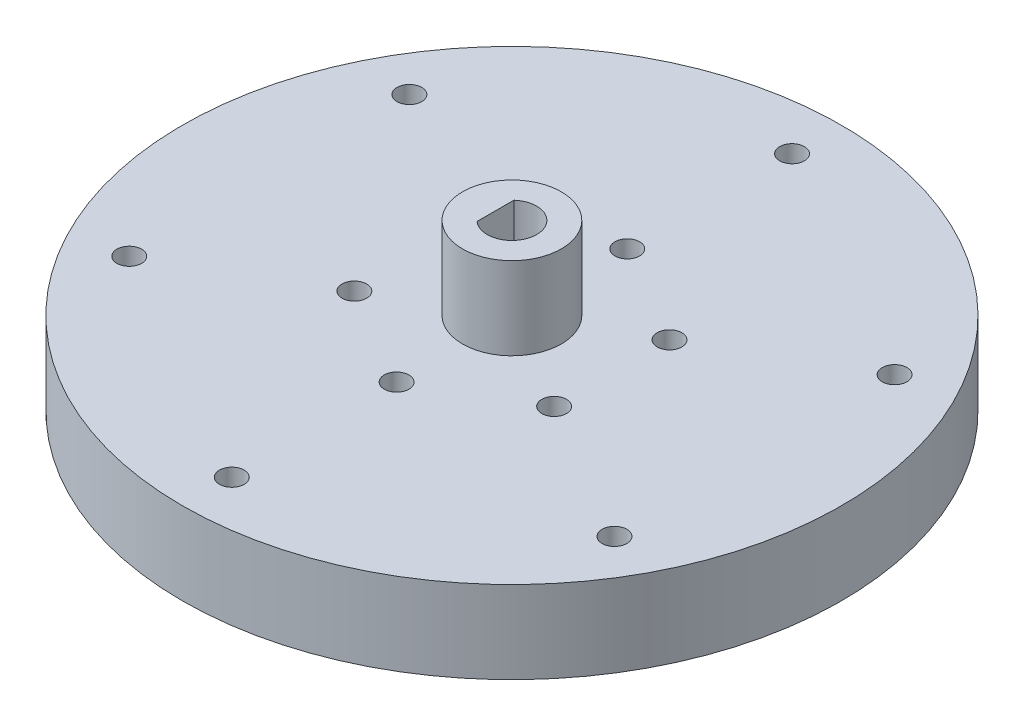
ISO-10303-21;
HEADER;
FILE_DESCRIPTION(('STEP AP214'),'2;1');
FILE_NAME('part.step','',(''),(''),'','','');
FILE_SCHEMA(('AUTOMOTIVE_DESIGN { 1 0 10303 214 1 1 1 1 }'));
ENDSEC;
DATA;
#1=APPLICATION_CONTEXT('core data for automotive mechanical design processes');
#2=APPLICATION_PROTOCOL_DEFINITION('international standard','automotive_design',2000,#1);
#3=PRODUCT_CONTEXT('',#1,'mechanical');
#4=PRODUCT('Part','Part','',(#3));
#5=PRODUCT_RELATED_PRODUCT_CATEGORY('part','',(#4));
#6=PRODUCT_DEFINITION_FORMATION('','',#4);
#7=PRODUCT_DEFINITION_CONTEXT('part definition',#1,'design');
#8=PRODUCT_DEFINITION('design','',#6,#7);
#9=PRODUCT_DEFINITION_SHAPE('','',#8);
#10=(LENGTH_UNIT() NAMED_UNIT(*) SI_UNIT(.MILLI.,.METRE.));
#11=(NAMED_UNIT(*) PLANE_ANGLE_UNIT() SI_UNIT($,.RADIAN.));
#12=(NAMED_UNIT(*) SI_UNIT($,.STERADIAN.) SOLID_ANGLE_UNIT());
#13=UNCERTAINTY_MEASURE_WITH_UNIT(LENGTH_MEASURE(1.E-05),#10,'distance_accuracy_value','');
#14=(GEOMETRIC_REPRESENTATION_CONTEXT(3) GLOBAL_UNCERTAINTY_ASSIGNED_CONTEXT((#13)) GLOBAL_UNIT_ASSIGNED_CONTEXT((#10,
#11,#12)) REPRESENTATION_CONTEXT('',''));
#15=CARTESIAN_POINT('',(0.,0.,0.));
#16=DIRECTION('',(0.,0.,1.));
#17=DIRECTION('',(1.,0.,0.));
#18=AXIS2_PLACEMENT_3D('',#15,#16,#17);
#19=CARTESIAN_POINT('',(0.,5.,0.));
#20=DIRECTION('',(0.,-1.,0.));
#21=DIRECTION('',(0.,0.,-1.));
#22=AXIS2_PLACEMENT_3D('',#19,#20,#21);
#23=CYLINDRICAL_SURFACE('',#22,20.);
#24=CARTESIAN_POINT('',(0.,5.,0.));
#25=DIRECTION('',(0.,1.,0.));
#26=DIRECTION('',(0.,0.,1.));
#27=AXIS2_PLACEMENT_3D('',#24,#25,#26);
#28=CIRCLE('',#27,20.);
#29=CARTESIAN_POINT('',(0.,5.,20.));
#30=VERTEX_POINT('',#29);
#31=EDGE_CURVE('E11',#30,#30,#28,.T.);
#32=ORIENTED_EDGE('',*,*,#31,.F.);
#33=EDGE_LOOP('',(#32));
#34=FACE_BOUND('',#33,.T.);
#35=CARTESIAN_POINT('',(0.,0.,0.));
#36=DIRECTION('',(0.,1.,0.));
#37=DIRECTION('',(0.,0.,1.));
#38=AXIS2_PLACEMENT_3D('',#35,#36,#37);
#39=CIRCLE('',#38,20.);
#40=CARTESIAN_POINT('',(0.,0.,20.));
#41=VERTEX_POINT('',#40);
#42=EDGE_CURVE('E44',#41,#41,#39,.T.);
#43=ORIENTED_EDGE('',*,*,#42,.T.);
#44=EDGE_LOOP('',(#43));
#45=FACE_BOUND('',#44,.T.);
#46=ADVANCED_FACE('F41',(#34,#45),#23,.T.);
#47=CARTESIAN_POINT('',(0.,5.,0.));
#48=DIRECTION('',(0.,1.,0.));
#49=DIRECTION('',(0.,0.,1.));
#50=AXIS2_PLACEMENT_3D('',#47,#48,#49);
#51=PLANE('',#50);
#52=CARTESIAN_POINT('',(0.,5.,17.));
#53=DIRECTION('',(0.,1.,0.));
#54=DIRECTION('',(0.,0.,1.));
#55=AXIS2_PLACEMENT_3D('',#52,#53,#54);
#56=CIRCLE('',#55,0.750000000000001);
#57=CARTESIAN_POINT('',(0.,5.,17.75));
#58=VERTEX_POINT('',#57);
#59=EDGE_CURVE('E347',#58,#58,#56,.T.);
#60=ORIENTED_EDGE('',*,*,#59,.F.);
#61=EDGE_LOOP('',(#60));
#62=FACE_BOUND('',#61,.T.);
#63=CARTESIAN_POINT('',(-6.0621778264911,5.,3.49999999999994));
#64=DIRECTION('',(0.,1.,0.));
#65=DIRECTION('',(0.,0.,1.));
#66=AXIS2_PLACEMENT_3D('',#63,#64,#65);
#67=CIRCLE('',#66,0.75);
#68=CARTESIAN_POINT('',(-6.0621778264911,5.,4.24999999999994));
#69=VERTEX_POINT('',#68);
#70=EDGE_CURVE('E352',#69,#69,#67,.T.);
#71=ORIENTED_EDGE('',*,*,#70,.F.);
#72=EDGE_LOOP('',(#71));
#73=FACE_BOUND('',#72,.T.);
#74=CARTESIAN_POINT('',(-14.7224318643355,5.,8.49999999999986));
#75=DIRECTION('',(0.,1.,0.));
#76=DIRECTION('',(0.,0.,1.));
#77=AXIS2_PLACEMENT_3D('',#74,#75,#76);
#78=CIRCLE('',#77,0.750000000000001);
#79=CARTESIAN_POINT('',(-14.7224318643355,5.,9.24999999999986));
#80=VERTEX_POINT('',#79);
#81=EDGE_CURVE('E365',#80,#80,#78,.T.);
#82=ORIENTED_EDGE('',*,*,#81,.F.);
#83=EDGE_LOOP('',(#82));
#84=FACE_BOUND('',#83,.T.);
#85=CARTESIAN_POINT('',(-6.06217782649103,5.,-3.50000000000007));
#86=DIRECTION('',(0.,1.,0.));
#87=DIRECTION('',(0.,0.,1.));
#88=AXIS2_PLACEMENT_3D('',#85,#86,#87);
#89=CIRCLE('',#88,0.75);
#90=CARTESIAN_POINT('',(-6.06217782649103,5.,-2.75000000000007));
#91=VERTEX_POINT('',#90);
#92=EDGE_CURVE('E368',#91,#91,#89,.T.);
#93=ORIENTED_EDGE('',*,*,#92,.F.);
#94=EDGE_LOOP('',(#93));
#95=FACE_BOUND('',#94,.T.);
#96=CARTESIAN_POINT('',(0.,5.,7.));
#97=DIRECTION('',(0.,1.,0.));
#98=DIRECTION('',(0.,0.,1.));
#99=AXIS2_PLACEMENT_3D('',#96,#97,#98);
#100=CIRCLE('',#99,0.75);
#101=CARTESIAN_POINT('',(0.,5.,7.75));
#102=VERTEX_POINT('',#101);
#103=EDGE_CURVE('E371',#102,#102,#100,.T.);
#104=ORIENTED_EDGE('',*,*,#103,.F.);
#105=EDGE_LOOP('',(#104));
#106=FACE_BOUND('',#105,.T.);
#107=CARTESIAN_POINT('',(14.7224318643354,5.,8.50000000000007));
#108=DIRECTION('',(0.,1.,0.));
#109=DIRECTION('',(0.,0.,1.));
#110=AXIS2_PLACEMENT_3D('',#107,#108,#109);
#111=CIRCLE('',#110,0.750000000000001);
#112=CARTESIAN_POINT('',(14.7224318643354,5.,9.25000000000007));
#113=VERTEX_POINT('',#112);
#114=EDGE_CURVE('E374',#113,#113,#111,.T.);
#115=ORIENTED_EDGE('',*,*,#114,.F.);
#116=EDGE_LOOP('',(#115));
#117=FACE_BOUND('',#116,.T.);
#118=CARTESIAN_POINT('',(6.06217782649106,5.,3.50000000000003));
#119=DIRECTION('',(0.,1.,0.));
#120=DIRECTION('',(0.,0.,1.));
#121=AXIS2_PLACEMENT_3D('',#118,#119,#120);
#122=CIRCLE('',#121,0.75);
#123=CARTESIAN_POINT('',(6.06217782649106,5.,4.25000000000003));
#124=VERTEX_POINT('',#123);
#125=EDGE_CURVE('E377',#124,#124,#122,.T.);
#126=ORIENTED_EDGE('',*,*,#125,.F.);
#127=EDGE_LOOP('',(#126));
#128=FACE_BOUND('',#127,.T.);
#129=CARTESIAN_POINT('',(14.7224318643355,5.,-8.49999999999997));
#130=DIRECTION('',(0.,1.,0.));
#131=DIRECTION('',(0.,0.,1.));
#132=AXIS2_PLACEMENT_3D('',#129,#130,#131);
#133=CIRCLE('',#132,0.750000000000001);
#134=CARTESIAN_POINT('',(14.7224318643355,5.,-7.74999999999997));
#135=VERTEX_POINT('',#134);
#136=EDGE_CURVE('E380',#135,#135,#133,.T.);
#137=ORIENTED_EDGE('',*,*,#136,.F.);
#138=EDGE_LOOP('',(#137));
#139=FACE_BOUND('',#138,.T.);
#140=CARTESIAN_POINT('',(-14.7224318643354,5.,-8.50000000000017));
#141=DIRECTION('',(0.,1.,0.));
#142=DIRECTION('',(0.,0.,1.));
#143=AXIS2_PLACEMENT_3D('',#140,#141,#142);
#144=CIRCLE('',#143,0.750000000000001);
#145=CARTESIAN_POINT('',(-14.7224318643354,5.,-7.75000000000017));
#146=VERTEX_POINT('',#145);
#147=EDGE_CURVE('E383',#146,#146,#144,.T.);
#148=ORIENTED_EDGE('',*,*,#147,.F.);
#149=EDGE_LOOP('',(#148));
#150=FACE_BOUND('',#149,.T.);
#151=CARTESIAN_POINT('',(6.06217782649108,5.,-3.49999999999999));
#152=DIRECTION('',(0.,1.,0.));
#153=DIRECTION('',(0.,0.,1.));
#154=AXIS2_PLACEMENT_3D('',#151,#152,#153);
#155=CIRCLE('',#154,0.75);
#156=CARTESIAN_POINT('',(6.06217782649108,5.,-2.74999999999999));
#157=VERTEX_POINT('',#156);
#158=EDGE_CURVE('E386',#157,#157,#155,.T.);
#159=ORIENTED_EDGE('',*,*,#158,.F.);
#160=EDGE_LOOP('',(#159));
#161=FACE_BOUND('',#160,.T.);
#162=CARTESIAN_POINT('',(0.,5.,-7.));
#163=DIRECTION('',(0.,1.,0.));
#164=DIRECTION('',(0.,0.,1.));
#165=AXIS2_PLACEMENT_3D('',#162,#163,#164);
#166=CIRCLE('',#165,0.75);
#167=CARTESIAN_POINT('',(0.,5.,-6.25));
#168=VERTEX_POINT('',#167);
#169=EDGE_CURVE('E81',#168,#168,#166,.T.);
#170=ORIENTED_EDGE('',*,*,#169,.F.);
#171=EDGE_LOOP('',(#170));
#172=FACE_BOUND('',#171,.T.);
#173=CARTESIAN_POINT('',(0.,5.,-17.));
#174=DIRECTION('',(0.,1.,0.));
#175=DIRECTION('',(0.,0.,1.));
#176=AXIS2_PLACEMENT_3D('',#173,#174,#175);
#177=CIRCLE('',#176,0.750000000000001);
#178=CARTESIAN_POINT('',(0.,5.,-16.25));
#179=VERTEX_POINT('',#178);
#180=EDGE_CURVE('E341',#179,#179,#177,.T.);
#181=ORIENTED_EDGE('',*,*,#180,.F.);
#182=EDGE_LOOP('',(#181));
#183=FACE_BOUND('',#182,.T.);
#184=CARTESIAN_POINT('',(0.,5.,0.));
#185=DIRECTION('',(0.,1.,0.));
#186=DIRECTION('',(0.,0.,1.));
#187=AXIS2_PLACEMENT_3D('',#184,#185,#186);
#188=CIRCLE('',#187,3.);
#189=CARTESIAN_POINT('',(0.,5.,3.));
#190=VERTEX_POINT('',#189);
#191=EDGE_CURVE('E74',#190,#190,#188,.F.);
#192=ORIENTED_EDGE('',*,*,#191,.T.);
#193=EDGE_LOOP('',(#192));
#194=FACE_BOUND('',#193,.T.);
#195=ORIENTED_EDGE('',*,*,#31,.T.);
#196=EDGE_LOOP('',(#195));
#197=FACE_BOUND('',#196,.T.);
#198=ADVANCED_FACE('F100',(#62,#73,#84,#95,#106,#117,#128,#139,#150,#161,#172,#183,#194,#197),
#51,.T.);
#199=CARTESIAN_POINT('',(0.,0.,0.));
#200=DIRECTION('',(0.,1.,0.));
#201=DIRECTION('',(0.,0.,1.));
#202=AXIS2_PLACEMENT_3D('',#199,#200,#201);
#203=PLANE('',#202);
#204=CARTESIAN_POINT('',(0.,0.,17.));
#205=DIRECTION('',(0.,-1.,0.));
#206=DIRECTION('',(0.,0.,1.));
#207=AXIS2_PLACEMENT_3D('',#204,#205,#206);
#208=CIRCLE('',#207,0.750000000000001);
#209=CARTESIAN_POINT('',(0.,0.,17.75));
#210=VERTEX_POINT('',#209);
#211=EDGE_CURVE('E397',#210,#210,#208,.T.);
#212=ORIENTED_EDGE('',*,*,#211,.F.);
#213=EDGE_LOOP('',(#212));
#214=FACE_BOUND('',#213,.T.);
#215=CARTESIAN_POINT('',(-6.0621778264911,0.,3.49999999999994));
#216=DIRECTION('',(0.,-1.,0.));
#217=DIRECTION('',(-0.866025403784443,0.,0.499999999999992));
#218=AXIS2_PLACEMENT_3D('',#215,#216,#217);
#219=CIRCLE('',#218,0.75);
#220=CARTESIAN_POINT('',(-6.71169687932944,0.,3.87499999999994));
#221=VERTEX_POINT('',#220);
#222=EDGE_CURVE('E405',#221,#221,#219,.T.);
#223=ORIENTED_EDGE('',*,*,#222,.F.);
#224=EDGE_LOOP('',(#223));
#225=FACE_BOUND('',#224,.T.);
#226=CARTESIAN_POINT('',(-14.7224318643355,0.,8.49999999999986));
#227=DIRECTION('',(0.,-1.,0.));
#228=DIRECTION('',(-0.866025403784443,0.,0.499999999999992));
#229=AXIS2_PLACEMENT_3D('',#226,#227,#228);
#230=CIRCLE('',#229,0.750000000000001);
#231=CARTESIAN_POINT('',(-15.3719509171739,0.,8.87499999999986));
#232=VERTEX_POINT('',#231);
#233=EDGE_CURVE('E408',#232,#232,#230,.T.);
#234=ORIENTED_EDGE('',*,*,#233,.F.);
#235=EDGE_LOOP('',(#234));
#236=FACE_BOUND('',#235,.T.);
#237=CARTESIAN_POINT('',(-6.06217782649103,0.,-3.50000000000007));
#238=DIRECTION('',(0.,-1.,0.));
#239=DIRECTION('',(-0.866025403784433,0.,-0.50000000000001));
#240=AXIS2_PLACEMENT_3D('',#237,#238,#239);
#241=CIRCLE('',#240,0.75);
#242=CARTESIAN_POINT('',(-6.71169687932936,0.,-3.87500000000008));
#243=VERTEX_POINT('',#242);
#244=EDGE_CURVE('E411',#243,#243,#241,.T.);
#245=ORIENTED_EDGE('',*,*,#244,.F.);
#246=EDGE_LOOP('',(#245));
#247=FACE_BOUND('',#246,.T.);
#248=CARTESIAN_POINT('',(0.,0.,7.));
#249=DIRECTION('',(0.,-1.,0.));
#250=DIRECTION('',(0.,0.,1.));
#251=AXIS2_PLACEMENT_3D('',#248,#249,#250);
#252=CIRCLE('',#251,0.75);
#253=CARTESIAN_POINT('',(0.,0.,7.75));
#254=VERTEX_POINT('',#253);
#255=EDGE_CURVE('E393',#254,#254,#252,.T.);
#256=ORIENTED_EDGE('',*,*,#255,.F.);
#257=EDGE_LOOP('',(#256));
#258=FACE_BOUND('',#257,.T.);
#259=CARTESIAN_POINT('',(14.7224318643354,0.,8.50000000000007));
#260=DIRECTION('',(0.,-1.,0.));
#261=DIRECTION('',(0.866025403784436,0.,0.500000000000004));
#262=AXIS2_PLACEMENT_3D('',#259,#260,#261);
#263=CIRCLE('',#262,0.750000000000001);
#264=CARTESIAN_POINT('',(15.3719509171738,0.,8.87500000000007));
#265=VERTEX_POINT('',#264);
#266=EDGE_CURVE('E396',#265,#265,#263,.T.);
#267=ORIENTED_EDGE('',*,*,#266,.F.);
#268=EDGE_LOOP('',(#267));
#269=FACE_BOUND('',#268,.T.);
#270=CARTESIAN_POINT('',(6.06217782649106,0.,3.50000000000003));
#271=DIRECTION('',(0.,-1.,0.));
#272=DIRECTION('',(0.866025403784436,0.,0.500000000000004));
#273=AXIS2_PLACEMENT_3D('',#270,#271,#272);
#274=CIRCLE('',#273,0.75);
#275=CARTESIAN_POINT('',(6.71169687932938,0.,3.87500000000003));
#276=VERTEX_POINT('',#275);
#277=EDGE_CURVE('E400',#276,#276,#274,.T.);
#278=ORIENTED_EDGE('',*,*,#277,.F.);
#279=EDGE_LOOP('',(#278));
#280=FACE_BOUND('',#279,.T.);
#281=CARTESIAN_POINT('',(14.7224318643355,0.,-8.49999999999997));
#282=DIRECTION('',(0.,-1.,0.));
#283=DIRECTION('',(0.86602540378444,0.,-0.499999999999998));
#284=AXIS2_PLACEMENT_3D('',#281,#282,#283);
#285=CIRCLE('',#284,0.750000000000001);
#286=CARTESIAN_POINT('',(15.3719509171738,0.,-8.87499999999996));
#287=VERTEX_POINT('',#286);
#288=EDGE_CURVE('E392',#287,#287,#285,.T.);
#289=ORIENTED_EDGE('',*,*,#288,.F.);
#290=EDGE_LOOP('',(#289));
#291=FACE_BOUND('',#290,.T.);
#292=CARTESIAN_POINT('',(-14.7224318643354,0.,-8.50000000000017));
#293=DIRECTION('',(0.,-1.,0.));
#294=DIRECTION('',(-0.866025403784433,0.,-0.50000000000001));
#295=AXIS2_PLACEMENT_3D('',#292,#293,#294);
#296=CIRCLE('',#295,0.750000000000001);
#297=CARTESIAN_POINT('',(-15.3719509171737,0.,-8.87500000000018));
#298=VERTEX_POINT('',#297);
#299=EDGE_CURVE('E414',#298,#298,#296,.T.);
#300=ORIENTED_EDGE('',*,*,#299,.F.);
#301=EDGE_LOOP('',(#300));
#302=FACE_BOUND('',#301,.T.);
#303=CARTESIAN_POINT('',(6.06217782649108,0.,-3.49999999999999));
#304=DIRECTION('',(0.,-1.,0.));
#305=DIRECTION('',(0.86602540378444,0.,-0.499999999999998));
#306=AXIS2_PLACEMENT_3D('',#303,#304,#305);
#307=CIRCLE('',#306,0.75);
#308=CARTESIAN_POINT('',(6.71169687932941,0.,-3.87499999999998));
#309=VERTEX_POINT('',#308);
#310=EDGE_CURVE('E389',#309,#309,#307,.T.);
#311=ORIENTED_EDGE('',*,*,#310,.F.);
#312=EDGE_LOOP('',(#311));
#313=FACE_BOUND('',#312,.T.);
#314=CARTESIAN_POINT('',(0.,0.,-7.));
#315=DIRECTION('',(0.,-1.,0.));
#316=DIRECTION('',(0.,0.,-1.));
#317=AXIS2_PLACEMENT_3D('',#314,#315,#316);
#318=CIRCLE('',#317,0.75);
#319=CARTESIAN_POINT('',(0.,0.,-7.75));
#320=VERTEX_POINT('',#319);
#321=EDGE_CURVE('E346',#320,#320,#318,.T.);
#322=ORIENTED_EDGE('',*,*,#321,.F.);
#323=EDGE_LOOP('',(#322));
#324=FACE_BOUND('',#323,.T.);
#325=CARTESIAN_POINT('',(0.,0.,-17.));
#326=DIRECTION('',(0.,-1.,0.));
#327=DIRECTION('',(0.,0.,-1.));
#328=AXIS2_PLACEMENT_3D('',#325,#326,#327);
#329=CIRCLE('',#328,0.750000000000001);
#330=CARTESIAN_POINT('',(0.,0.,-17.75));
#331=VERTEX_POINT('',#330);
#332=EDGE_CURVE('E344',#331,#331,#329,.T.);
#333=ORIENTED_EDGE('',*,*,#332,.F.);
#334=EDGE_LOOP('',(#333));
#335=FACE_BOUND('',#334,.T.);
#336=ORIENTED_EDGE('',*,*,#42,.F.);
#337=EDGE_LOOP('',(#336));
#338=FACE_BOUND('',#337,.T.);
#339=ADVANCED_FACE('F98',(#214,#225,#236,#247,#258,#269,#280,#291,#302,#313,#324,#335,#338),
#203,.F.);
#340=CARTESIAN_POINT('',(0.,10.,0.));
#341=DIRECTION('',(0.,-1.,0.));
#342=DIRECTION('',(0.,0.,-1.));
#343=AXIS2_PLACEMENT_3D('',#340,#341,#342);
#344=CYLINDRICAL_SURFACE('',#343,1.5);
#345=DIRECTION('',(0.,-1.,0.));
#346=VECTOR('',#345,1.);
#347=CARTESIAN_POINT('',(-0.999999999999996,10.,-1.11803398874989));
#348=LINE('',#347,#346);
#349=CARTESIAN_POINT('',(-0.999999999999996,10.,-1.11803398874989));
#350=VERTEX_POINT('',#349);
#351=CARTESIAN_POINT('',(-0.999999999999996,5.,-1.11803398874989));
#352=VERTEX_POINT('',#351);
#353=EDGE_CURVE('E75',#350,#352,#348,.T.);
#354=ORIENTED_EDGE('',*,*,#353,.T.);
#355=CARTESIAN_POINT('',(0.,5.,0.));
#356=DIRECTION('',(0.,1.,0.));
#357=DIRECTION('',(0.,0.,1.));
#358=AXIS2_PLACEMENT_3D('',#355,#356,#357);
#359=CIRCLE('',#358,1.5);
#360=CARTESIAN_POINT('',(-1.,5.,1.1180339887499));
#361=VERTEX_POINT('',#360);
#362=EDGE_CURVE('E57',#352,#361,#359,.F.);
#363=ORIENTED_EDGE('',*,*,#362,.T.);
#364=DIRECTION('',(0.,-1.,0.));
#365=VECTOR('',#364,1.);
#366=CARTESIAN_POINT('',(-0.999999999999997,10.,1.11803398874989));
#367=LINE('',#366,#365);
#368=CARTESIAN_POINT('',(-0.999999999999997,10.,1.11803398874989));
#369=VERTEX_POINT('',#368);
#370=EDGE_CURVE('E66',#369,#361,#367,.T.);
#371=ORIENTED_EDGE('',*,*,#370,.F.);
#372=CARTESIAN_POINT('',(0.,10.,0.));
#373=DIRECTION('',(0.,1.,0.));
#374=DIRECTION('',(0.,0.,1.));
#375=AXIS2_PLACEMENT_3D('',#372,#373,#374);
#376=CIRCLE('',#375,1.5);
#377=EDGE_CURVE('E70',#369,#350,#376,.T.);
#378=ORIENTED_EDGE('',*,*,#377,.T.);
#379=EDGE_LOOP('',(#354,#363,#371,#378));
#380=FACE_BOUND('',#379,.T.);
#381=ADVANCED_FACE('F69',(#380),#344,.F.);
#382=CARTESIAN_POINT('',(-1.,10.,0.));
#383=DIRECTION('',(1.,0.,0.));
#384=DIRECTION('',(0.,0.,-1.));
#385=AXIS2_PLACEMENT_3D('',#382,#383,#384);
#386=PLANE('',#385);
#387=ORIENTED_EDGE('',*,*,#370,.T.);
#388=DIRECTION('',(0.,0.,-1.));
#389=VECTOR('',#388,1.);
#390=CARTESIAN_POINT('',(-1.,5.,0.));
#391=LINE('',#390,#389);
#392=EDGE_CURVE('E54',#361,#352,#391,.T.);
#393=ORIENTED_EDGE('',*,*,#392,.T.);
#394=ORIENTED_EDGE('',*,*,#353,.F.);
#395=DIRECTION('',(0.,0.,1.));
#396=VECTOR('',#395,1.);
#397=CARTESIAN_POINT('',(-1.,10.,0.));
#398=LINE('',#397,#396);
#399=EDGE_CURVE('E80',#350,#369,#398,.T.);
#400=ORIENTED_EDGE('',*,*,#399,.T.);
#401=EDGE_LOOP('',(#387,#393,#394,#400));
#402=FACE_BOUND('',#401,.T.);
#403=ADVANCED_FACE('F83',(#402),#386,.T.);
#404=CARTESIAN_POINT('',(0.,10.,0.));
#405=DIRECTION('',(0.,-1.,0.));
#406=DIRECTION('',(0.,0.,-1.));
#407=AXIS2_PLACEMENT_3D('',#404,#405,#406);
#408=CYLINDRICAL_SURFACE('',#407,3.);
#409=ORIENTED_EDGE('',*,*,#191,.F.);
#410=EDGE_LOOP('',(#409));
#411=FACE_BOUND('',#410,.T.);
#412=CARTESIAN_POINT('',(0.,10.,0.));
#413=DIRECTION('',(0.,1.,0.));
#414=DIRECTION('',(0.,0.,1.));
#415=AXIS2_PLACEMENT_3D('',#412,#413,#414);
#416=CIRCLE('',#415,3.);
#417=CARTESIAN_POINT('',(0.,10.,3.));
#418=VERTEX_POINT('',#417);
#419=EDGE_CURVE('E84',#418,#418,#416,.T.);
#420=ORIENTED_EDGE('',*,*,#419,.F.);
#421=EDGE_LOOP('',(#420));
#422=FACE_BOUND('',#421,.T.);
#423=ADVANCED_FACE('F281',(#411,#422),#408,.T.);
#424=CARTESIAN_POINT('',(0.,10.,0.));
#425=DIRECTION('',(0.,1.,0.));
#426=DIRECTION('',(0.,0.,1.));
#427=AXIS2_PLACEMENT_3D('',#424,#425,#426);
#428=PLANE('',#427);
#429=ORIENTED_EDGE('',*,*,#377,.F.);
#430=ORIENTED_EDGE('',*,*,#399,.F.);
#431=EDGE_LOOP('',(#429,#430));
#432=FACE_BOUND('',#431,.T.);
#433=ORIENTED_EDGE('',*,*,#419,.T.);
#434=EDGE_LOOP('',(#433));
#435=FACE_BOUND('',#434,.T.);
#436=ADVANCED_FACE('F78',(#432,#435),#428,.T.);
#437=ORIENTED_EDGE('',*,*,#362,.F.);
#438=ORIENTED_EDGE('',*,*,#392,.F.);
#439=EDGE_LOOP('',(#437,#438));
#440=FACE_BOUND('',#439,.T.);
#441=ADVANCED_FACE('F109',(#440),#51,.T.);
#442=CARTESIAN_POINT('',(0.,10.,-17.));
#443=DIRECTION('',(0.,-1.,0.));
#444=DIRECTION('',(0.,0.,-1.));
#445=AXIS2_PLACEMENT_3D('',#442,#443,#444);
#446=CYLINDRICAL_SURFACE('',#445,0.750000000000001);
#447=ORIENTED_EDGE('',*,*,#180,.T.);
#448=EDGE_LOOP('',(#447));
#449=FACE_BOUND('',#448,.T.);
#450=ORIENTED_EDGE('',*,*,#332,.T.);
#451=EDGE_LOOP('',(#450));
#452=FACE_BOUND('',#451,.T.);
#453=ADVANCED_FACE('F263',(#449,#452),#446,.F.);
#454=CARTESIAN_POINT('',(0.,10.,-7.));
#455=DIRECTION('',(0.,-1.,0.));
#456=DIRECTION('',(0.,0.,-1.));
#457=AXIS2_PLACEMENT_3D('',#454,#455,#456);
#458=CYLINDRICAL_SURFACE('',#457,0.75);
#459=ORIENTED_EDGE('',*,*,#169,.T.);
#460=EDGE_LOOP('',(#459));
#461=FACE_BOUND('',#460,.T.);
#462=ORIENTED_EDGE('',*,*,#321,.T.);
#463=EDGE_LOOP('',(#462));
#464=FACE_BOUND('',#463,.T.);
#465=ADVANCED_FACE('F130',(#461,#464),#458,.F.);
#466=CARTESIAN_POINT('',(6.06217782649108,10.,-3.49999999999999));
#467=DIRECTION('',(0.,-1.,0.));
#468=DIRECTION('',(0.,0.,-1.));
#469=AXIS2_PLACEMENT_3D('',#466,#467,#468);
#470=CYLINDRICAL_SURFACE('',#469,0.75);
#471=ORIENTED_EDGE('',*,*,#158,.T.);
#472=EDGE_LOOP('',(#471));
#473=FACE_BOUND('',#472,.T.);
#474=ORIENTED_EDGE('',*,*,#310,.T.);
#475=EDGE_LOOP('',(#474));
#476=FACE_BOUND('',#475,.T.);
#477=ADVANCED_FACE('F141',(#473,#476),#470,.F.);
#478=CARTESIAN_POINT('',(-14.7224318643354,10.,-8.50000000000017));
#479=DIRECTION('',(0.,-1.,0.));
#480=DIRECTION('',(0.,0.,-1.));
#481=AXIS2_PLACEMENT_3D('',#478,#479,#480);
#482=CYLINDRICAL_SURFACE('',#481,0.750000000000001);
#483=ORIENTED_EDGE('',*,*,#147,.T.);
#484=EDGE_LOOP('',(#483));
#485=FACE_BOUND('',#484,.T.);
#486=ORIENTED_EDGE('',*,*,#299,.T.);
#487=EDGE_LOOP('',(#486));
#488=FACE_BOUND('',#487,.T.);
#489=ADVANCED_FACE('F146',(#485,#488),#482,.F.);
#490=CARTESIAN_POINT('',(14.7224318643355,10.,-8.49999999999997));
#491=DIRECTION('',(0.,-1.,0.));
#492=DIRECTION('',(0.,0.,-1.));
#493=AXIS2_PLACEMENT_3D('',#490,#491,#492);
#494=CYLINDRICAL_SURFACE('',#493,0.750000000000001);
#495=ORIENTED_EDGE('',*,*,#136,.T.);
#496=EDGE_LOOP('',(#495));
#497=FACE_BOUND('',#496,.T.);
#498=ORIENTED_EDGE('',*,*,#288,.T.);
#499=EDGE_LOOP('',(#498));
#500=FACE_BOUND('',#499,.T.);
#501=ADVANCED_FACE('F157',(#497,#500),#494,.F.);
#502=CARTESIAN_POINT('',(6.06217782649106,10.,3.50000000000003));
#503=DIRECTION('',(0.,-1.,0.));
#504=DIRECTION('',(0.,0.,-1.));
#505=AXIS2_PLACEMENT_3D('',#502,#503,#504);
#506=CYLINDRICAL_SURFACE('',#505,0.75);
#507=ORIENTED_EDGE('',*,*,#125,.T.);
#508=EDGE_LOOP('',(#507));
#509=FACE_BOUND('',#508,.T.);
#510=ORIENTED_EDGE('',*,*,#277,.T.);
#511=EDGE_LOOP('',(#510));
#512=FACE_BOUND('',#511,.T.);
#513=ADVANCED_FACE('F168',(#509,#512),#506,.F.);
#514=CARTESIAN_POINT('',(14.7224318643354,10.,8.50000000000007));
#515=DIRECTION('',(0.,-1.,0.));
#516=DIRECTION('',(0.,0.,-1.));
#517=AXIS2_PLACEMENT_3D('',#514,#515,#516);
#518=CYLINDRICAL_SURFACE('',#517,0.750000000000001);
#519=ORIENTED_EDGE('',*,*,#114,.T.);
#520=EDGE_LOOP('',(#519));
#521=FACE_BOUND('',#520,.T.);
#522=ORIENTED_EDGE('',*,*,#266,.T.);
#523=EDGE_LOOP('',(#522));
#524=FACE_BOUND('',#523,.T.);
#525=ADVANCED_FACE('F179',(#521,#524),#518,.F.);
#526=CARTESIAN_POINT('',(0.,10.,7.));
#527=DIRECTION('',(0.,-1.,0.));
#528=DIRECTION('',(0.,0.,-1.));
#529=AXIS2_PLACEMENT_3D('',#526,#527,#528);
#530=CYLINDRICAL_SURFACE('',#529,0.75);
#531=ORIENTED_EDGE('',*,*,#103,.T.);
#532=EDGE_LOOP('',(#531));
#533=FACE_BOUND('',#532,.T.);
#534=ORIENTED_EDGE('',*,*,#255,.T.);
#535=EDGE_LOOP('',(#534));
#536=FACE_BOUND('',#535,.T.);
#537=ADVANCED_FACE('F190',(#533,#536),#530,.F.);
#538=CARTESIAN_POINT('',(-6.06217782649103,10.,-3.50000000000007));
#539=DIRECTION('',(0.,-1.,0.));
#540=DIRECTION('',(0.,0.,-1.));
#541=AXIS2_PLACEMENT_3D('',#538,#539,#540);
#542=CYLINDRICAL_SURFACE('',#541,0.75);
#543=ORIENTED_EDGE('',*,*,#92,.T.);
#544=EDGE_LOOP('',(#543));
#545=FACE_BOUND('',#544,.T.);
#546=ORIENTED_EDGE('',*,*,#244,.T.);
#547=EDGE_LOOP('',(#546));
#548=FACE_BOUND('',#547,.T.);
#549=ADVANCED_FACE('F201',(#545,#548),#542,.F.);
#550=CARTESIAN_POINT('',(-14.7224318643355,10.,8.49999999999986));
#551=DIRECTION('',(0.,-1.,0.));
#552=DIRECTION('',(0.,0.,-1.));
#553=AXIS2_PLACEMENT_3D('',#550,#551,#552);
#554=CYLINDRICAL_SURFACE('',#553,0.750000000000001);
#555=ORIENTED_EDGE('',*,*,#81,.T.);
#556=EDGE_LOOP('',(#555));
#557=FACE_BOUND('',#556,.T.);
#558=ORIENTED_EDGE('',*,*,#233,.T.);
#559=EDGE_LOOP('',(#558));
#560=FACE_BOUND('',#559,.T.);
#561=ADVANCED_FACE('F212',(#557,#560),#554,.F.);
#562=CARTESIAN_POINT('',(-6.0621778264911,10.,3.49999999999994));
#563=DIRECTION('',(0.,-1.,0.));
#564=DIRECTION('',(0.,0.,-1.));
#565=AXIS2_PLACEMENT_3D('',#562,#563,#564);
#566=CYLINDRICAL_SURFACE('',#565,0.75);
#567=ORIENTED_EDGE('',*,*,#70,.T.);
#568=EDGE_LOOP('',(#567));
#569=FACE_BOUND('',#568,.T.);
#570=ORIENTED_EDGE('',*,*,#222,.T.);
#571=EDGE_LOOP('',(#570));
#572=FACE_BOUND('',#571,.T.);
#573=ADVANCED_FACE('F223',(#569,#572),#566,.F.);
#574=CARTESIAN_POINT('',(0.,10.,17.));
#575=DIRECTION('',(0.,-1.,0.));
#576=DIRECTION('',(0.,0.,-1.));
#577=AXIS2_PLACEMENT_3D('',#574,#575,#576);
#578=CYLINDRICAL_SURFACE('',#577,0.750000000000001);
#579=ORIENTED_EDGE('',*,*,#59,.T.);
#580=EDGE_LOOP('',(#579));
#581=FACE_BOUND('',#580,.T.);
#582=ORIENTED_EDGE('',*,*,#211,.T.);
#583=EDGE_LOOP('',(#582));
#584=FACE_BOUND('',#583,.T.);
#585=ADVANCED_FACE('F234',(#581,#584),#578,.F.);
#586=CLOSED_SHELL('',(#46,#198,#339,#381,#403,#423,#436,#441,#453,#465,#477,#489,#501,#513,#525,
#537,#549,#561,#573,#585));
#587=MANIFOLD_SOLID_BREP('B2',#586);
#588=ADVANCED_BREP_SHAPE_REPRESENTATION('',(#18,#587),#14);
#589=SHAPE_DEFINITION_REPRESENTATION(#9,#588);
ENDSEC;
END-ISO-10303-21;
